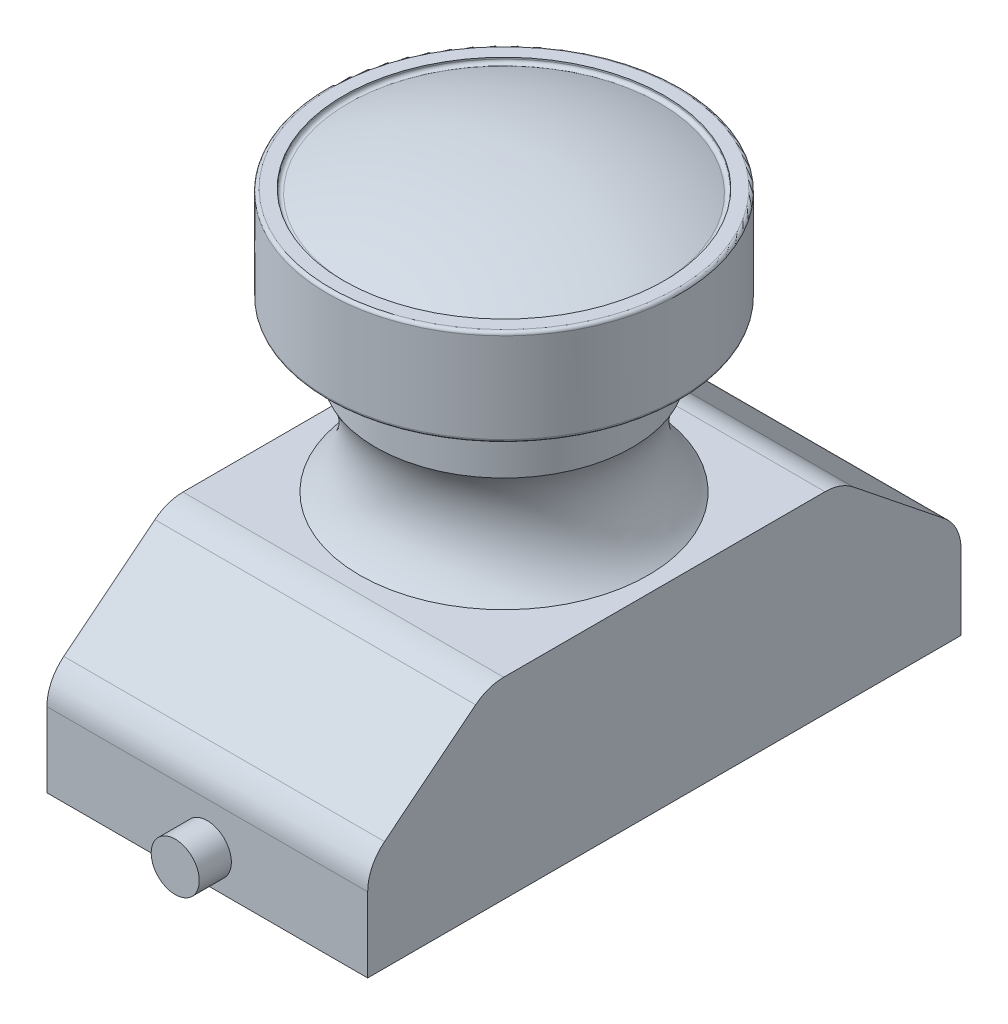
ISO-10303-21;
HEADER;
FILE_DESCRIPTION(('STEP AP214'),'2;1');
FILE_NAME('part.step','',(''),(''),'','','');
FILE_SCHEMA(('AUTOMOTIVE_DESIGN { 1 0 10303 214 1 1 1 1 }'));
ENDSEC;
DATA;
#1=APPLICATION_CONTEXT('core data for automotive mechanical design processes');
#2=APPLICATION_PROTOCOL_DEFINITION('international standard','automotive_design',2000,#1);
#3=PRODUCT_CONTEXT('',#1,'mechanical');
#4=PRODUCT('Part','Part','',(#3));
#5=PRODUCT_RELATED_PRODUCT_CATEGORY('part','',(#4));
#6=PRODUCT_DEFINITION_FORMATION('','',#4);
#7=PRODUCT_DEFINITION_CONTEXT('part definition',#1,'design');
#8=PRODUCT_DEFINITION('design','',#6,#7);
#9=PRODUCT_DEFINITION_SHAPE('','',#8);
#10=(LENGTH_UNIT() NAMED_UNIT(*) SI_UNIT(.MILLI.,.METRE.));
#11=(NAMED_UNIT(*) PLANE_ANGLE_UNIT() SI_UNIT($,.RADIAN.));
#12=(NAMED_UNIT(*) SI_UNIT($,.STERADIAN.) SOLID_ANGLE_UNIT());
#13=UNCERTAINTY_MEASURE_WITH_UNIT(LENGTH_MEASURE(1.E-05),#10,'distance_accuracy_value','');
#14=(GEOMETRIC_REPRESENTATION_CONTEXT(3) GLOBAL_UNCERTAINTY_ASSIGNED_CONTEXT((#13)) GLOBAL_UNIT_ASSIGNED_CONTEXT((#10,
#11,#12)) REPRESENTATION_CONTEXT('',''));
#15=CARTESIAN_POINT('',(0.,0.,0.));
#16=DIRECTION('',(0.,0.,1.));
#17=DIRECTION('',(1.,0.,0.));
#18=AXIS2_PLACEMENT_3D('',#15,#16,#17);
#19=CARTESIAN_POINT('',(5.,0.,9.25));
#20=DIRECTION('',(0.,0.,-1.));
#21=DIRECTION('',(0.,1.,0.));
#22=AXIS2_PLACEMENT_3D('',#19,#20,#21);
#23=PLANE('',#22);
#24=CARTESIAN_POINT('',(0.,1.,9.25));
#25=DIRECTION('',(0.,0.,-1.));
#26=DIRECTION('',(0.,1.,0.));
#27=AXIS2_PLACEMENT_3D('',#24,#25,#26);
#28=CIRCLE('',#27,0.75);
#29=CARTESIAN_POINT('',(0.,1.75,9.25));
#30=VERTEX_POINT('',#29);
#31=EDGE_CURVE('E51',#30,#30,#28,.T.);
#32=ORIENTED_EDGE('',*,*,#31,.T.);
#33=EDGE_LOOP('',(#32));
#34=FACE_BOUND('',#33,.T.);
#35=DIRECTION('',(0.,-1.,0.));
#36=VECTOR('',#35,1.);
#37=CARTESIAN_POINT('',(5.,0.,9.25));
#38=LINE('',#37,#36);
#39=CARTESIAN_POINT('',(5.,2.3271252135188,9.25));
#40=VERTEX_POINT('',#39);
#41=CARTESIAN_POINT('',(5.,0.,9.25));
#42=VERTEX_POINT('',#41);
#43=EDGE_CURVE('E243',#40,#42,#38,.T.);
#44=ORIENTED_EDGE('',*,*,#43,.F.);
#45=DIRECTION('',(-1.,0.,0.));
#46=VECTOR('',#45,1.);
#47=CARTESIAN_POINT('',(5.,2.3271252135188,9.25));
#48=LINE('',#47,#46);
#49=CARTESIAN_POINT('',(-5.,2.3271252135188,9.25));
#50=VERTEX_POINT('',#49);
#51=EDGE_CURVE('E196',#40,#50,#48,.T.);
#52=ORIENTED_EDGE('',*,*,#51,.T.);
#53=DIRECTION('',(0.,-1.,0.));
#54=VECTOR('',#53,1.);
#55=CARTESIAN_POINT('',(-5.,0.,9.25));
#56=LINE('',#55,#54);
#57=CARTESIAN_POINT('',(-5.,0.,9.25));
#58=VERTEX_POINT('',#57);
#59=EDGE_CURVE('E230',#50,#58,#56,.T.);
#60=ORIENTED_EDGE('',*,*,#59,.T.);
#61=DIRECTION('',(-1.,0.,0.));
#62=VECTOR('',#61,1.);
#63=CARTESIAN_POINT('',(5.,0.,9.25));
#64=LINE('',#63,#62);
#65=EDGE_CURVE('E244',#42,#58,#64,.T.);
#66=ORIENTED_EDGE('',*,*,#65,.F.);
#67=EDGE_LOOP('',(#44,#52,#60,#66));
#68=FACE_BOUND('',#67,.T.);
#69=ADVANCED_FACE('F50',(#34,#68),#23,.F.);
#70=CARTESIAN_POINT('',(5.,0.,9.25));
#71=DIRECTION('',(0.,1.,0.));
#72=DIRECTION('',(0.,0.,1.));
#73=AXIS2_PLACEMENT_3D('',#70,#71,#72);
#74=PLANE('',#73);
#75=DIRECTION('',(0.,0.,-1.));
#76=VECTOR('',#75,1.);
#77=CARTESIAN_POINT('',(-5.,0.,9.25));
#78=LINE('',#77,#76);
#79=CARTESIAN_POINT('',(-5.,0.,-9.25));
#80=VERTEX_POINT('',#79);
#81=EDGE_CURVE('E229',#58,#80,#78,.T.);
#82=ORIENTED_EDGE('',*,*,#81,.T.);
#83=DIRECTION('',(-1.,0.,0.));
#84=VECTOR('',#83,1.);
#85=CARTESIAN_POINT('',(5.,0.,-9.25));
#86=LINE('',#85,#84);
#87=CARTESIAN_POINT('',(5.,0.,-9.25));
#88=VERTEX_POINT('',#87);
#89=EDGE_CURVE('E222',#88,#80,#86,.T.);
#90=ORIENTED_EDGE('',*,*,#89,.F.);
#91=DIRECTION('',(0.,0.,-1.));
#92=VECTOR('',#91,1.);
#93=CARTESIAN_POINT('',(5.,0.,9.25));
#94=LINE('',#93,#92);
#95=EDGE_CURVE('E284',#42,#88,#94,.T.);
#96=ORIENTED_EDGE('',*,*,#95,.F.);
#97=ORIENTED_EDGE('',*,*,#65,.T.);
#98=EDGE_LOOP('',(#82,#90,#96,#97));
#99=FACE_BOUND('',#98,.T.);
#100=ADVANCED_FACE('F150',(#99),#74,.F.);
#101=CARTESIAN_POINT('',(5.,0.,-9.25));
#102=DIRECTION('',(0.,0.,1.));
#103=DIRECTION('',(1.,0.,0.));
#104=AXIS2_PLACEMENT_3D('',#101,#102,#103);
#105=PLANE('',#104);
#106=CARTESIAN_POINT('',(0.,1.,-9.25));
#107=DIRECTION('',(0.,0.,1.));
#108=DIRECTION('',(1.,0.,0.));
#109=AXIS2_PLACEMENT_3D('',#106,#107,#108);
#110=CIRCLE('',#109,0.75);
#111=CARTESIAN_POINT('',(0.75,1.,-9.25));
#112=VERTEX_POINT('',#111);
#113=EDGE_CURVE('E11',#112,#112,#110,.F.);
#114=ORIENTED_EDGE('',*,*,#113,.F.);
#115=EDGE_LOOP('',(#114));
#116=FACE_BOUND('',#115,.T.);
#117=DIRECTION('',(0.,1.,0.));
#118=VECTOR('',#117,1.);
#119=CARTESIAN_POINT('',(-5.,0.,-9.25));
#120=LINE('',#119,#118);
#121=CARTESIAN_POINT('',(-5.,2.3271252135188,-9.25));
#122=VERTEX_POINT('',#121);
#123=EDGE_CURVE('E235',#80,#122,#120,.T.);
#124=ORIENTED_EDGE('',*,*,#123,.T.);
#125=DIRECTION('',(-1.,0.,0.));
#126=VECTOR('',#125,1.);
#127=CARTESIAN_POINT('',(5.,2.3271252135188,-9.25));
#128=LINE('',#127,#126);
#129=CARTESIAN_POINT('',(5.,2.3271252135188,-9.25));
#130=VERTEX_POINT('',#129);
#131=EDGE_CURVE('E193',#122,#130,#128,.F.);
#132=ORIENTED_EDGE('',*,*,#131,.T.);
#133=DIRECTION('',(0.,1.,0.));
#134=VECTOR('',#133,1.);
#135=CARTESIAN_POINT('',(5.,0.,-9.25));
#136=LINE('',#135,#134);
#137=EDGE_CURVE('E224',#88,#130,#136,.T.);
#138=ORIENTED_EDGE('',*,*,#137,.F.);
#139=ORIENTED_EDGE('',*,*,#89,.T.);
#140=EDGE_LOOP('',(#124,#132,#138,#139));
#141=FACE_BOUND('',#140,.T.);
#142=ADVANCED_FACE('F154',(#116,#141),#105,.F.);
#143=CARTESIAN_POINT('',(5.,3.,-9.25));
#144=DIRECTION('',(0.,-0.78086880944303,0.624695047554424));
#145=DIRECTION('',(0.,-0.624695047554424,-0.78086880944303));
#146=AXIS2_PLACEMENT_3D('',#143,#144,#145);
#147=PLANE('',#146);
#148=DIRECTION('',(0.,0.624695047554424,0.78086880944303));
#149=VECTOR('',#148,1.);
#150=CARTESIAN_POINT('',(5.,3.,-9.25));
#151=LINE('',#150,#149);
#152=CARTESIAN_POINT('',(5.,3.42034154673905,-8.72457306657619));
#153=VERTEX_POINT('',#152);
#154=CARTESIAN_POINT('',(5.,5.69321633322024,-5.8834795834747));
#155=VERTEX_POINT('',#154);
#156=EDGE_CURVE('E218',#153,#155,#151,.T.);
#157=ORIENTED_EDGE('',*,*,#156,.F.);
#158=DIRECTION('',(-1.,0.,0.));
#159=VECTOR('',#158,1.);
#160=CARTESIAN_POINT('',(5.,3.42034154673905,-8.72457306657619));
#161=LINE('',#160,#159);
#162=CARTESIAN_POINT('',(-5.,3.42034154673905,-8.72457306657619));
#163=VERTEX_POINT('',#162);
#164=EDGE_CURVE('E270',#153,#163,#161,.T.);
#165=ORIENTED_EDGE('',*,*,#164,.T.);
#166=DIRECTION('',(0.,0.624695047554424,0.78086880944303));
#167=VECTOR('',#166,1.);
#168=CARTESIAN_POINT('',(-5.,3.,-9.25));
#169=LINE('',#168,#167);
#170=CARTESIAN_POINT('',(-5.,5.69321633322024,-5.8834795834747));
#171=VERTEX_POINT('',#170);
#172=EDGE_CURVE('E231',#163,#171,#169,.T.);
#173=ORIENTED_EDGE('',*,*,#172,.T.);
#174=DIRECTION('',(-1.,0.,0.));
#175=VECTOR('',#174,1.);
#176=CARTESIAN_POINT('',(5.,5.69321633322024,-5.8834795834747));
#177=LINE('',#176,#175);
#178=EDGE_CURVE('E264',#171,#155,#177,.F.);
#179=ORIENTED_EDGE('',*,*,#178,.T.);
#180=EDGE_LOOP('',(#157,#165,#173,#179));
#181=FACE_BOUND('',#180,.T.);
#182=ADVANCED_FACE('F289',(#181),#147,.F.);
#183=CARTESIAN_POINT('',(5.,6.,-5.5));
#184=DIRECTION('',(0.,-1.,0.));
#185=DIRECTION('',(0.,0.,-1.));
#186=AXIS2_PLACEMENT_3D('',#183,#184,#185);
#187=PLANE('',#186);
#188=CARTESIAN_POINT('',(0.,6.,0.));
#189=DIRECTION('',(0.,1.,0.));
#190=DIRECTION('',(0.,0.,1.));
#191=AXIS2_PLACEMENT_3D('',#188,#189,#190);
#192=CIRCLE('',#191,4.5);
#193=CARTESIAN_POINT('',(0.,6.,4.5));
#194=VERTEX_POINT('',#193);
#195=EDGE_CURVE('E250',#194,#194,#192,.T.);
#196=ORIENTED_EDGE('',*,*,#195,.F.);
#197=EDGE_LOOP('',(#196));
#198=FACE_BOUND('',#197,.T.);
#199=DIRECTION('',(0.,0.,1.));
#200=VECTOR('',#199,1.);
#201=CARTESIAN_POINT('',(-5.,6.,-5.5));
#202=LINE('',#201,#200);
#203=CARTESIAN_POINT('',(-5.,6.,-5.0089065168985));
#204=VERTEX_POINT('',#203);
#205=CARTESIAN_POINT('',(-5.,6.,5.0089065168985));
#206=VERTEX_POINT('',#205);
#207=EDGE_CURVE('E213',#204,#206,#202,.T.);
#208=ORIENTED_EDGE('',*,*,#207,.T.);
#209=DIRECTION('',(-1.,0.,0.));
#210=VECTOR('',#209,1.);
#211=CARTESIAN_POINT('',(5.,6.,5.0089065168985));
#212=LINE('',#211,#210);
#213=CARTESIAN_POINT('',(5.,6.,5.0089065168985));
#214=VERTEX_POINT('',#213);
#215=EDGE_CURVE('E57',#206,#214,#212,.F.);
#216=ORIENTED_EDGE('',*,*,#215,.T.);
#217=DIRECTION('',(0.,0.,1.));
#218=VECTOR('',#217,1.);
#219=CARTESIAN_POINT('',(5.,6.,-5.5));
#220=LINE('',#219,#218);
#221=CARTESIAN_POINT('',(5.,6.,-5.0089065168985));
#222=VERTEX_POINT('',#221);
#223=EDGE_CURVE('E209',#222,#214,#220,.T.);
#224=ORIENTED_EDGE('',*,*,#223,.F.);
#225=DIRECTION('',(-1.,0.,0.));
#226=VECTOR('',#225,1.);
#227=CARTESIAN_POINT('',(5.,6.,-5.0089065168985));
#228=LINE('',#227,#226);
#229=EDGE_CURVE('E201',#222,#204,#228,.T.);
#230=ORIENTED_EDGE('',*,*,#229,.T.);
#231=EDGE_LOOP('',(#208,#216,#224,#230));
#232=FACE_BOUND('',#231,.T.);
#233=ADVANCED_FACE('F207',(#198,#232),#187,.F.);
#234=CARTESIAN_POINT('',(5.,3.,9.25));
#235=DIRECTION('',(0.,-0.78086880944303,-0.624695047554425));
#236=DIRECTION('',(0.,0.624695047554425,-0.78086880944303));
#237=AXIS2_PLACEMENT_3D('',#234,#235,#236);
#238=PLANE('',#237);
#239=DIRECTION('',(0.,-0.624695047554425,0.78086880944303));
#240=VECTOR('',#239,1.);
#241=CARTESIAN_POINT('',(-5.,3.,9.25));
#242=LINE('',#241,#240);
#243=CARTESIAN_POINT('',(-5.,5.69321633322024,5.8834795834747));
#244=VERTEX_POINT('',#243);
#245=CARTESIAN_POINT('',(-5.,3.42034154673904,8.72457306657619));
#246=VERTEX_POINT('',#245);
#247=EDGE_CURVE('E239',#244,#246,#242,.T.);
#248=ORIENTED_EDGE('',*,*,#247,.T.);
#249=DIRECTION('',(-1.,0.,0.));
#250=VECTOR('',#249,1.);
#251=CARTESIAN_POINT('',(5.,3.42034154673904,8.72457306657619));
#252=LINE('',#251,#250);
#253=CARTESIAN_POINT('',(5.,3.42034154673904,8.72457306657619));
#254=VERTEX_POINT('',#253);
#255=EDGE_CURVE('E61',#246,#254,#252,.F.);
#256=ORIENTED_EDGE('',*,*,#255,.T.);
#257=DIRECTION('',(0.,-0.624695047554425,0.78086880944303));
#258=VECTOR('',#257,1.);
#259=CARTESIAN_POINT('',(5.,3.,9.25));
#260=LINE('',#259,#258);
#261=CARTESIAN_POINT('',(5.,5.69321633322024,5.8834795834747));
#262=VERTEX_POINT('',#261);
#263=EDGE_CURVE('E217',#262,#254,#260,.T.);
#264=ORIENTED_EDGE('',*,*,#263,.F.);
#265=DIRECTION('',(-1.,0.,0.));
#266=VECTOR('',#265,1.);
#267=CARTESIAN_POINT('',(5.,5.69321633322024,5.8834795834747));
#268=LINE('',#267,#266);
#269=EDGE_CURVE('E190',#262,#244,#268,.T.);
#270=ORIENTED_EDGE('',*,*,#269,.T.);
#271=EDGE_LOOP('',(#248,#256,#264,#270));
#272=FACE_BOUND('',#271,.T.);
#273=ADVANCED_FACE('F294',(#272),#238,.F.);
#274=CARTESIAN_POINT('',(5.,0.,0.));
#275=DIRECTION('',(1.,0.,0.));
#276=DIRECTION('',(0.,0.,-1.));
#277=AXIS2_PLACEMENT_3D('',#274,#275,#276);
#278=PLANE('',#277);
#279=ORIENTED_EDGE('',*,*,#137,.T.);
#280=CARTESIAN_POINT('',(5.,2.3271252135188,-7.85));
#281=DIRECTION('',(1.,0.,0.));
#282=DIRECTION('',(0.,0.,-1.));
#283=AXIS2_PLACEMENT_3D('',#280,#281,#282);
#284=CIRCLE('',#283,1.4);
#285=EDGE_CURVE('E192',#130,#153,#284,.T.);
#286=ORIENTED_EDGE('',*,*,#285,.T.);
#287=ORIENTED_EDGE('',*,*,#156,.T.);
#288=CARTESIAN_POINT('',(5.,4.6,-5.0089065168985));
#289=DIRECTION('',(1.,0.,0.));
#290=DIRECTION('',(0.,0.,-1.));
#291=AXIS2_PLACEMENT_3D('',#288,#289,#290);
#292=CIRCLE('',#291,1.4);
#293=EDGE_CURVE('E189',#155,#222,#292,.T.);
#294=ORIENTED_EDGE('',*,*,#293,.T.);
#295=ORIENTED_EDGE('',*,*,#223,.T.);
#296=CARTESIAN_POINT('',(5.,4.6,5.0089065168985));
#297=DIRECTION('',(1.,0.,0.));
#298=DIRECTION('',(0.,0.,-1.));
#299=AXIS2_PLACEMENT_3D('',#296,#297,#298);
#300=CIRCLE('',#299,1.4);
#301=EDGE_CURVE('E66',#214,#262,#300,.T.);
#302=ORIENTED_EDGE('',*,*,#301,.T.);
#303=ORIENTED_EDGE('',*,*,#263,.T.);
#304=CARTESIAN_POINT('',(5.,2.3271252135188,7.85));
#305=DIRECTION('',(1.,0.,0.));
#306=DIRECTION('',(0.,0.,-1.));
#307=AXIS2_PLACEMENT_3D('',#304,#305,#306);
#308=CIRCLE('',#307,1.4);
#309=EDGE_CURVE('E186',#254,#40,#308,.T.);
#310=ORIENTED_EDGE('',*,*,#309,.T.);
#311=ORIENTED_EDGE('',*,*,#43,.T.);
#312=ORIENTED_EDGE('',*,*,#95,.T.);
#313=EDGE_LOOP('',(#279,#286,#287,#294,#295,#302,#303,#310,#311,#312));
#314=FACE_BOUND('',#313,.T.);
#315=ADVANCED_FACE('F214',(#314),#278,.T.);
#316=CARTESIAN_POINT('',(-5.,0.,0.));
#317=DIRECTION('',(1.,0.,0.));
#318=DIRECTION('',(0.,0.,-1.));
#319=AXIS2_PLACEMENT_3D('',#316,#317,#318);
#320=PLANE('',#319);
#321=ORIENTED_EDGE('',*,*,#172,.F.);
#322=CARTESIAN_POINT('',(-5.,2.3271252135188,-7.85));
#323=DIRECTION('',(1.,0.,0.));
#324=DIRECTION('',(0.,0.,-1.));
#325=AXIS2_PLACEMENT_3D('',#322,#323,#324);
#326=CIRCLE('',#325,1.4);
#327=EDGE_CURVE('E277',#163,#122,#326,.F.);
#328=ORIENTED_EDGE('',*,*,#327,.T.);
#329=ORIENTED_EDGE('',*,*,#123,.F.);
#330=ORIENTED_EDGE('',*,*,#81,.F.);
#331=ORIENTED_EDGE('',*,*,#59,.F.);
#332=CARTESIAN_POINT('',(-5.,2.3271252135188,7.85));
#333=DIRECTION('',(1.,0.,0.));
#334=DIRECTION('',(0.,0.,-1.));
#335=AXIS2_PLACEMENT_3D('',#332,#333,#334);
#336=CIRCLE('',#335,1.4);
#337=EDGE_CURVE('E273',#50,#246,#336,.F.);
#338=ORIENTED_EDGE('',*,*,#337,.T.);
#339=ORIENTED_EDGE('',*,*,#247,.F.);
#340=CARTESIAN_POINT('',(-5.,4.6,5.0089065168985));
#341=DIRECTION('',(1.,0.,0.));
#342=DIRECTION('',(0.,0.,-1.));
#343=AXIS2_PLACEMENT_3D('',#340,#341,#342);
#344=CIRCLE('',#343,1.4);
#345=EDGE_CURVE('E275',#244,#206,#344,.F.);
#346=ORIENTED_EDGE('',*,*,#345,.T.);
#347=ORIENTED_EDGE('',*,*,#207,.F.);
#348=CARTESIAN_POINT('',(-5.,4.6,-5.0089065168985));
#349=DIRECTION('',(1.,0.,0.));
#350=DIRECTION('',(0.,0.,-1.));
#351=AXIS2_PLACEMENT_3D('',#348,#349,#350);
#352=CIRCLE('',#351,1.4);
#353=EDGE_CURVE('E269',#204,#171,#352,.F.);
#354=ORIENTED_EDGE('',*,*,#353,.T.);
#355=EDGE_LOOP('',(#321,#328,#329,#330,#331,#338,#339,#346,#347,#354));
#356=FACE_BOUND('',#355,.T.);
#357=ADVANCED_FACE('F295',(#356),#320,.F.);
#358=CARTESIAN_POINT('',(0.,7.89402615915736,0.));
#359=DIRECTION('',(0.,1.,0.));
#360=DIRECTION('',(0.,0.,1.));
#361=AXIS2_PLACEMENT_3D('',#358,#359,#360);
#362=TOROIDAL_SURFACE('',#361,6.13176741860708,2.5);
#363=CARTESIAN_POINT('',(0.,9.2,0.));
#364=DIRECTION('',(0.,1.,0.));
#365=DIRECTION('',(0.,0.,1.));
#366=AXIS2_PLACEMENT_3D('',#363,#364,#365);
#367=CIRCLE('',#366,4.);
#368=CARTESIAN_POINT('',(0.,9.2,4.));
#369=VERTEX_POINT('',#368);
#370=EDGE_CURVE('E227',#369,#369,#367,.T.);
#371=ORIENTED_EDGE('',*,*,#370,.F.);
#372=EDGE_LOOP('',(#371));
#373=FACE_BOUND('',#372,.T.);
#374=ORIENTED_EDGE('',*,*,#195,.T.);
#375=EDGE_LOOP('',(#374));
#376=FACE_BOUND('',#375,.T.);
#377=ADVANCED_FACE('F352',(#373,#376),#362,.F.);
#378=CARTESIAN_POINT('',(0.,14.,0.));
#379=DIRECTION('',(0.,1.,0.));
#380=DIRECTION('',(0.,0.,1.));
#381=AXIS2_PLACEMENT_3D('',#378,#379,#380);
#382=CYLINDRICAL_SURFACE('',#381,4.);
#383=CARTESIAN_POINT('',(0.,11.2,0.));
#384=DIRECTION('',(0.,1.,0.));
#385=DIRECTION('',(0.,0.,1.));
#386=AXIS2_PLACEMENT_3D('',#383,#384,#385);
#387=CIRCLE('',#386,4.);
#388=CARTESIAN_POINT('',(0.,11.2,4.));
#389=VERTEX_POINT('',#388);
#390=EDGE_CURVE('E306',#389,#389,#387,.T.);
#391=ORIENTED_EDGE('',*,*,#390,.F.);
#392=EDGE_LOOP('',(#391));
#393=FACE_BOUND('',#392,.T.);
#394=ORIENTED_EDGE('',*,*,#370,.T.);
#395=EDGE_LOOP('',(#394));
#396=FACE_BOUND('',#395,.T.);
#397=ADVANCED_FACE('F356',(#393,#396),#382,.T.);
#398=CARTESIAN_POINT('',(0.,11.2,-5.5));
#399=DIRECTION('',(0.,1.,0.));
#400=DIRECTION('',(0.,0.,1.));
#401=AXIS2_PLACEMENT_3D('',#398,#399,#400);
#402=PLANE('',#401);
#403=CARTESIAN_POINT('',(0.,11.2,0.));
#404=DIRECTION('',(0.,1.,0.));
#405=DIRECTION('',(0.,0.,1.));
#406=AXIS2_PLACEMENT_3D('',#403,#404,#405);
#407=CIRCLE('',#406,5.4);
#408=CARTESIAN_POINT('',(0.,11.2,5.4));
#409=VERTEX_POINT('',#408);
#410=EDGE_CURVE('E255',#409,#409,#407,.F.);
#411=ORIENTED_EDGE('',*,*,#410,.T.);
#412=EDGE_LOOP('',(#411));
#413=FACE_BOUND('',#412,.T.);
#414=ORIENTED_EDGE('',*,*,#390,.T.);
#415=EDGE_LOOP('',(#414));
#416=FACE_BOUND('',#415,.T.);
#417=ADVANCED_FACE('F365',(#413,#416),#402,.F.);
#418=CARTESIAN_POINT('',(0.,14.,0.));
#419=DIRECTION('',(0.,1.,0.));
#420=DIRECTION('',(0.,0.,1.));
#421=AXIS2_PLACEMENT_3D('',#418,#419,#420);
#422=CYLINDRICAL_SURFACE('',#421,5.5);
#423=CARTESIAN_POINT('',(0.,11.3,0.));
#424=DIRECTION('',(0.,1.,0.));
#425=DIRECTION('',(0.,0.,1.));
#426=AXIS2_PLACEMENT_3D('',#423,#424,#425);
#427=CIRCLE('',#426,5.5);
#428=CARTESIAN_POINT('',(0.,11.3,5.5));
#429=VERTEX_POINT('',#428);
#430=EDGE_CURVE('E253',#429,#429,#427,.T.);
#431=ORIENTED_EDGE('',*,*,#430,.T.);
#432=EDGE_LOOP('',(#431));
#433=FACE_BOUND('',#432,.T.);
#434=CARTESIAN_POINT('',(0.,14.1,0.));
#435=DIRECTION('',(0.,-1.,0.));
#436=DIRECTION('',(0.,0.,-1.));
#437=AXIS2_PLACEMENT_3D('',#434,#435,#436);
#438=CIRCLE('',#437,5.5);
#439=CARTESIAN_POINT('',(0.,14.1,-5.5));
#440=VERTEX_POINT('',#439);
#441=EDGE_CURVE('E248',#440,#440,#438,.T.);
#442=ORIENTED_EDGE('',*,*,#441,.T.);
#443=EDGE_LOOP('',(#442));
#444=FACE_BOUND('',#443,.T.);
#445=ADVANCED_FACE('F366',(#433,#444),#422,.T.);
#446=CARTESIAN_POINT('',(0.,14.2,-5.));
#447=DIRECTION('',(0.,-1.,0.));
#448=DIRECTION('',(0.,0.,-1.));
#449=AXIS2_PLACEMENT_3D('',#446,#447,#448);
#450=PLANE('',#449);
#451=CARTESIAN_POINT('',(0.,14.2,0.));
#452=DIRECTION('',(0.,-1.,0.));
#453=DIRECTION('',(0.,0.,-1.));
#454=AXIS2_PLACEMENT_3D('',#451,#452,#453);
#455=CIRCLE('',#454,5.4);
#456=CARTESIAN_POINT('',(0.,14.2,-5.4));
#457=VERTEX_POINT('',#456);
#458=EDGE_CURVE('E265',#457,#457,#455,.F.);
#459=ORIENTED_EDGE('',*,*,#458,.T.);
#460=EDGE_LOOP('',(#459));
#461=FACE_BOUND('',#460,.T.);
#462=CARTESIAN_POINT('',(0.,14.2,0.));
#463=DIRECTION('',(0.,1.,0.));
#464=DIRECTION('',(0.,0.,1.));
#465=AXIS2_PLACEMENT_3D('',#462,#463,#464);
#466=CIRCLE('',#465,5.);
#467=CARTESIAN_POINT('',(0.,14.2,5.));
#468=VERTEX_POINT('',#467);
#469=EDGE_CURVE('E313',#468,#468,#466,.T.);
#470=ORIENTED_EDGE('',*,*,#469,.F.);
#471=EDGE_LOOP('',(#470));
#472=FACE_BOUND('',#471,.T.);
#473=ADVANCED_FACE('F143',(#461,#472),#450,.F.);
#474=CARTESIAN_POINT('',(0.,14.,0.));
#475=DIRECTION('',(0.,1.,0.));
#476=DIRECTION('',(0.,0.,1.));
#477=AXIS2_PLACEMENT_3D('',#474,#475,#476);
#478=CYLINDRICAL_SURFACE('',#477,5.);
#479=CARTESIAN_POINT('',(0.,14.151701238125,0.));
#480=DIRECTION('',(0.,1.,0.));
#481=DIRECTION('',(0.,0.,1.));
#482=AXIS2_PLACEMENT_3D('',#479,#480,#481);
#483=CIRCLE('',#482,5.);
#484=CARTESIAN_POINT('',(0.,14.151701238125,5.));
#485=VERTEX_POINT('',#484);
#486=EDGE_CURVE('E259',#485,#485,#483,.F.);
#487=ORIENTED_EDGE('',*,*,#486,.T.);
#488=EDGE_LOOP('',(#487));
#489=FACE_BOUND('',#488,.T.);
#490=ORIENTED_EDGE('',*,*,#469,.T.);
#491=EDGE_LOOP('',(#490));
#492=FACE_BOUND('',#491,.T.);
#493=ADVANCED_FACE('F133',(#489,#492),#478,.F.);
#494=CARTESIAN_POINT('',(0.,3.00167236240251,0.200334472480502));
#495=DIRECTION('',(-1.,0.,0.));
#496=DIRECTION('',(0.,0.,1.));
#497=AXIS2_PLACEMENT_3D('',#494,#495,#496);
#498=CIRCLE('',#497,12.);
#499=TRIMMED_CURVE('',#498,(PARAMETER_VALUE(-1.58749164174817)),
(PARAMETER_VALUE(1.58749164174817)),.T.,.PARAMETER.);
#500=CARTESIAN_POINT('',(0.,3.00167236240251,0.));
#501=DIRECTION('',(0.,1.,0.));
#502=AXIS1_PLACEMENT('',#500,#501);
#503=SURFACE_OF_REVOLUTION('',#499,#502);
#504=CARTESIAN_POINT('',(0.,14.0595522391521,0.));
#505=DIRECTION('',(0.,-1.,0.));
#506=DIRECTION('',(0.,0.,-1.));
#507=AXIS2_PLACEMENT_3D('',#504,#505,#506);
#508=CIRCLE('',#507,4.86115978902876);
#509=CARTESIAN_POINT('',(0.,14.0595522391521,-4.86115978902877));
#510=VERTEX_POINT('',#509);
#511=EDGE_CURVE('E260',#510,#510,#508,.F.);
#512=ORIENTED_EDGE('',*,*,#511,.T.);
#513=EDGE_LOOP('',(#512));
#514=FACE_BOUND('',#513,.T.);
#515=CARTESIAN_POINT('',(0.,15.,0.));
#516=VERTEX_POINT('',#515);
#517=VERTEX_LOOP('',#516);
#518=FACE_BOUND('',#517,.T.);
#519=ADVANCED_FACE('F126',(#514,#518),#503,.T.);
#520=CARTESIAN_POINT('',(0.,11.3,0.));
#521=DIRECTION('',(0.,1.,0.));
#522=DIRECTION('',(0.,0.,1.));
#523=AXIS2_PLACEMENT_3D('',#520,#521,#522);
#524=TOROIDAL_SURFACE('',#523,5.4,0.1);
#525=ORIENTED_EDGE('',*,*,#410,.F.);
#526=EDGE_LOOP('',(#525));
#527=FACE_BOUND('',#526,.T.);
#528=ORIENTED_EDGE('',*,*,#430,.F.);
#529=EDGE_LOOP('',(#528));
#530=FACE_BOUND('',#529,.T.);
#531=ADVANCED_FACE('F128',(#527,#530),#524,.T.);
#532=CARTESIAN_POINT('',(0.,14.151701238125,0.));
#533=DIRECTION('',(0.,1.,0.));
#534=DIRECTION('',(0.,0.,1.));
#535=AXIS2_PLACEMENT_3D('',#532,#533,#534);
#536=TOROIDAL_SURFACE('',#535,4.9,0.1);
#537=ORIENTED_EDGE('',*,*,#486,.F.);
#538=EDGE_LOOP('',(#537));
#539=FACE_BOUND('',#538,.T.);
#540=ORIENTED_EDGE('',*,*,#511,.F.);
#541=EDGE_LOOP('',(#540));
#542=FACE_BOUND('',#541,.T.);
#543=ADVANCED_FACE('F140',(#539,#542),#536,.F.);
#544=CARTESIAN_POINT('',(0.,14.1,0.));
#545=DIRECTION('',(0.,-1.,0.));
#546=DIRECTION('',(0.,0.,-1.));
#547=AXIS2_PLACEMENT_3D('',#544,#545,#546);
#548=TOROIDAL_SURFACE('',#547,5.4,0.1);
#549=ORIENTED_EDGE('',*,*,#441,.F.);
#550=EDGE_LOOP('',(#549));
#551=FACE_BOUND('',#550,.T.);
#552=ORIENTED_EDGE('',*,*,#458,.F.);
#553=EDGE_LOOP('',(#552));
#554=FACE_BOUND('',#553,.T.);
#555=ADVANCED_FACE('F163',(#551,#554),#548,.T.);
#556=CARTESIAN_POINT('',(5.,2.3271252135188,-7.85));
#557=DIRECTION('',(-1.,0.,0.));
#558=DIRECTION('',(0.,0.,1.));
#559=AXIS2_PLACEMENT_3D('',#556,#557,#558);
#560=CYLINDRICAL_SURFACE('',#559,1.4);
#561=ORIENTED_EDGE('',*,*,#285,.F.);
#562=ORIENTED_EDGE('',*,*,#131,.F.);
#563=ORIENTED_EDGE('',*,*,#327,.F.);
#564=ORIENTED_EDGE('',*,*,#164,.F.);
#565=EDGE_LOOP('',(#561,#562,#563,#564));
#566=FACE_BOUND('',#565,.T.);
#567=ADVANCED_FACE('F169',(#566),#560,.T.);
#568=CARTESIAN_POINT('',(5.,2.3271252135188,7.85));
#569=DIRECTION('',(-1.,0.,0.));
#570=DIRECTION('',(0.,0.,1.));
#571=AXIS2_PLACEMENT_3D('',#568,#569,#570);
#572=CYLINDRICAL_SURFACE('',#571,1.4);
#573=ORIENTED_EDGE('',*,*,#309,.F.);
#574=ORIENTED_EDGE('',*,*,#255,.F.);
#575=ORIENTED_EDGE('',*,*,#337,.F.);
#576=ORIENTED_EDGE('',*,*,#51,.F.);
#577=EDGE_LOOP('',(#573,#574,#575,#576));
#578=FACE_BOUND('',#577,.T.);
#579=ADVANCED_FACE('F175',(#578),#572,.T.);
#580=CARTESIAN_POINT('',(5.,4.6,5.0089065168985));
#581=DIRECTION('',(-1.,0.,0.));
#582=DIRECTION('',(0.,0.,1.));
#583=AXIS2_PLACEMENT_3D('',#580,#581,#582);
#584=CYLINDRICAL_SURFACE('',#583,1.4);
#585=ORIENTED_EDGE('',*,*,#301,.F.);
#586=ORIENTED_EDGE('',*,*,#215,.F.);
#587=ORIENTED_EDGE('',*,*,#345,.F.);
#588=ORIENTED_EDGE('',*,*,#269,.F.);
#589=EDGE_LOOP('',(#585,#586,#587,#588));
#590=FACE_BOUND('',#589,.T.);
#591=ADVANCED_FACE('F172',(#590),#584,.T.);
#592=CARTESIAN_POINT('',(5.,4.6,-5.0089065168985));
#593=DIRECTION('',(-1.,0.,0.));
#594=DIRECTION('',(0.,0.,1.));
#595=AXIS2_PLACEMENT_3D('',#592,#593,#594);
#596=CYLINDRICAL_SURFACE('',#595,1.4);
#597=ORIENTED_EDGE('',*,*,#293,.F.);
#598=ORIENTED_EDGE('',*,*,#178,.F.);
#599=ORIENTED_EDGE('',*,*,#353,.F.);
#600=ORIENTED_EDGE('',*,*,#229,.F.);
#601=EDGE_LOOP('',(#597,#598,#599,#600));
#602=FACE_BOUND('',#601,.T.);
#603=ADVANCED_FACE('F47',(#602),#596,.T.);
#604=CARTESIAN_POINT('',(0.,1.,-10.25));
#605=DIRECTION('',(0.,0.,1.));
#606=DIRECTION('',(1.,0.,0.));
#607=AXIS2_PLACEMENT_3D('',#604,#605,#606);
#608=CYLINDRICAL_SURFACE('',#607,0.75);
#609=CARTESIAN_POINT('',(0.,1.,-10.25));
#610=DIRECTION('',(0.,0.,-1.));
#611=DIRECTION('',(-1.,0.,0.));
#612=AXIS2_PLACEMENT_3D('',#609,#610,#611);
#613=CIRCLE('',#612,0.75);
#614=CARTESIAN_POINT('',(-0.75,1.,-10.25));
#615=VERTEX_POINT('',#614);
#616=EDGE_CURVE('E314',#615,#615,#613,.T.);
#617=ORIENTED_EDGE('',*,*,#616,.F.);
#618=EDGE_LOOP('',(#617));
#619=FACE_BOUND('',#618,.T.);
#620=ORIENTED_EDGE('',*,*,#113,.T.);
#621=EDGE_LOOP('',(#620));
#622=FACE_BOUND('',#621,.T.);
#623=ADVANCED_FACE('F185',(#619,#622),#608,.T.);
#624=CARTESIAN_POINT('',(0.,1.,-10.25));
#625=DIRECTION('',(0.,0.,-1.));
#626=DIRECTION('',(-1.,0.,0.));
#627=AXIS2_PLACEMENT_3D('',#624,#625,#626);
#628=PLANE('',#627);
#629=ORIENTED_EDGE('',*,*,#616,.T.);
#630=EDGE_LOOP('',(#629));
#631=FACE_BOUND('',#630,.T.);
#632=ADVANCED_FACE('F324',(#631),#628,.T.);
#633=CARTESIAN_POINT('',(0.,1.,10.25));
#634=DIRECTION('',(0.,0.,-1.));
#635=DIRECTION('',(-1.,0.,0.));
#636=AXIS2_PLACEMENT_3D('',#633,#634,#635);
#637=CYLINDRICAL_SURFACE('',#636,0.75);
#638=CARTESIAN_POINT('',(0.,1.,10.25));
#639=DIRECTION('',(0.,0.,-1.));
#640=DIRECTION('',(-1.,0.,0.));
#641=AXIS2_PLACEMENT_3D('',#638,#639,#640);
#642=CIRCLE('',#641,0.75);
#643=CARTESIAN_POINT('',(-0.75,1.,10.25));
#644=VERTEX_POINT('',#643);
#645=EDGE_CURVE('E320',#644,#644,#642,.T.);
#646=ORIENTED_EDGE('',*,*,#645,.T.);
#647=EDGE_LOOP('',(#646));
#648=FACE_BOUND('',#647,.T.);
#649=ORIENTED_EDGE('',*,*,#31,.F.);
#650=EDGE_LOOP('',(#649));
#651=FACE_BOUND('',#650,.T.);
#652=ADVANCED_FACE('F323',(#648,#651),#637,.T.);
#653=CARTESIAN_POINT('',(0.,1.,10.25));
#654=DIRECTION('',(0.,0.,1.));
#655=DIRECTION('',(-1.,0.,0.));
#656=AXIS2_PLACEMENT_3D('',#653,#654,#655);
#657=PLANE('',#656);
#658=ORIENTED_EDGE('',*,*,#645,.F.);
#659=EDGE_LOOP('',(#658));
#660=FACE_BOUND('',#659,.T.);
#661=ADVANCED_FACE('F322',(#660),#657,.T.);
#662=CLOSED_SHELL('',(#69,#100,#142,#182,#233,#273,#315,#357,#377,#397,#417,#445,#473,#493,#519,
#531,#543,#555,#567,#579,#591,#603,#623,#632,#652,#661));
#663=MANIFOLD_SOLID_BREP('B2',#662);
#664=ADVANCED_BREP_SHAPE_REPRESENTATION('',(#18,#663),#14);
#665=SHAPE_DEFINITION_REPRESENTATION(#9,#664);
ENDSEC;
END-ISO-10303-21;
